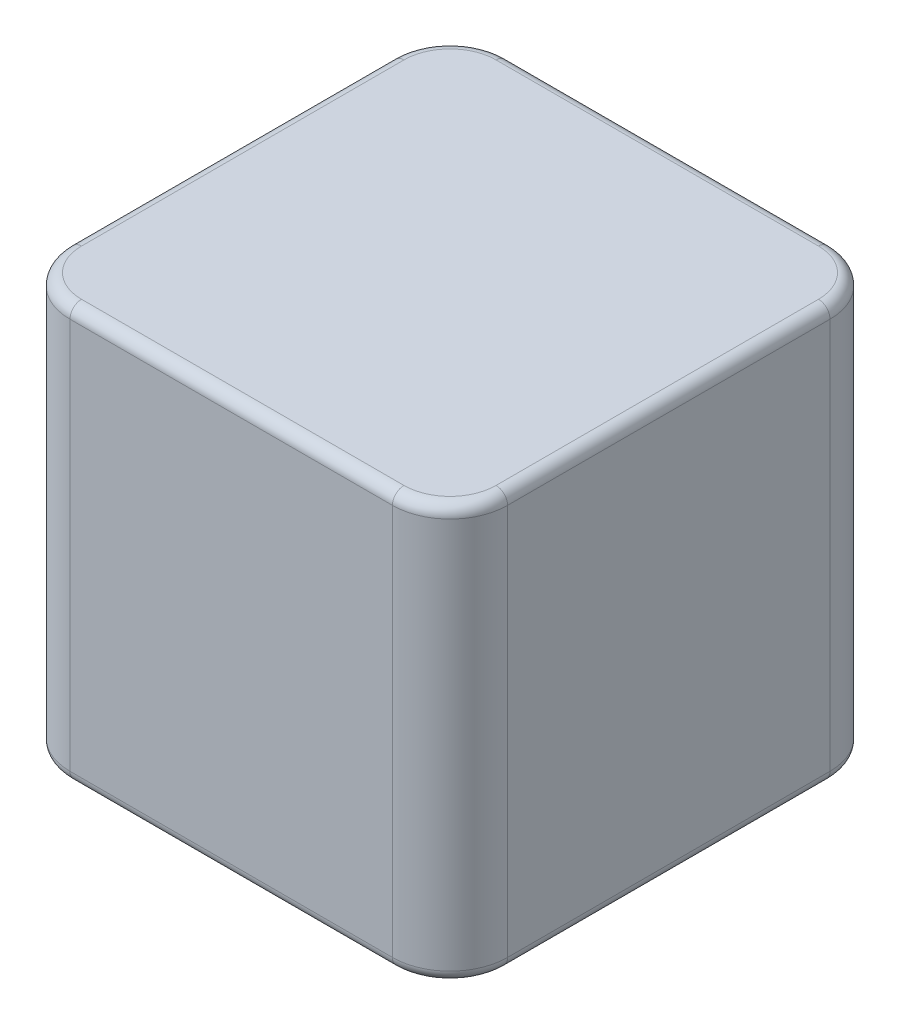
ISO-10303-21;
HEADER;
FILE_DESCRIPTION(('STEP AP214'),'2;1');
FILE_NAME('part.step','',(''),(''),'','','');
FILE_SCHEMA(('AUTOMOTIVE_DESIGN { 1 0 10303 214 1 1 1 1 }'));
ENDSEC;
DATA;
#1=APPLICATION_CONTEXT('core data for automotive mechanical design processes');
#2=APPLICATION_PROTOCOL_DEFINITION('international standard','automotive_design',2000,#1);
#3=PRODUCT_CONTEXT('',#1,'mechanical');
#4=PRODUCT('Part','Part','',(#3));
#5=PRODUCT_RELATED_PRODUCT_CATEGORY('part','',(#4));
#6=PRODUCT_DEFINITION_FORMATION('','',#4);
#7=PRODUCT_DEFINITION_CONTEXT('part definition',#1,'design');
#8=PRODUCT_DEFINITION('design','',#6,#7);
#9=PRODUCT_DEFINITION_SHAPE('','',#8);
#10=(LENGTH_UNIT() NAMED_UNIT(*) SI_UNIT(.MILLI.,.METRE.));
#11=(NAMED_UNIT(*) PLANE_ANGLE_UNIT() SI_UNIT($,.RADIAN.));
#12=(NAMED_UNIT(*) SI_UNIT($,.STERADIAN.) SOLID_ANGLE_UNIT());
#13=UNCERTAINTY_MEASURE_WITH_UNIT(LENGTH_MEASURE(1.E-05),#10,'distance_accuracy_value','');
#14=(GEOMETRIC_REPRESENTATION_CONTEXT(3) GLOBAL_UNCERTAINTY_ASSIGNED_CONTEXT((#13)) GLOBAL_UNIT_ASSIGNED_CONTEXT((#10,
#11,#12)) REPRESENTATION_CONTEXT('',''));
#15=CARTESIAN_POINT('',(0.,0.,0.));
#16=DIRECTION('',(0.,0.,1.));
#17=DIRECTION('',(1.,0.,0.));
#18=AXIS2_PLACEMENT_3D('',#15,#16,#17);
#19=CARTESIAN_POINT('',(19.,36.,19.));
#20=DIRECTION('',(-1.,0.,0.));
#21=DIRECTION('',(0.,0.,1.));
#22=AXIS2_PLACEMENT_3D('',#19,#20,#21);
#23=PLANE('',#22);
#24=DIRECTION('',(0.,-1.,0.));
#25=VECTOR('',#24,1.);
#26=CARTESIAN_POINT('',(19.,36.,14.));
#27=LINE('',#26,#25);
#28=CARTESIAN_POINT('',(19.,35.,14.));
#29=VERTEX_POINT('',#28);
#30=CARTESIAN_POINT('',(19.,1.,14.));
#31=VERTEX_POINT('',#30);
#32=EDGE_CURVE('E295',#29,#31,#27,.T.);
#33=ORIENTED_EDGE('',*,*,#32,.T.);
#34=DIRECTION('',(0.,0.,-1.));
#35=VECTOR('',#34,1.);
#36=CARTESIAN_POINT('',(19.,1.,-14.));
#37=LINE('',#36,#35);
#38=CARTESIAN_POINT('',(19.,1.,-14.));
#39=VERTEX_POINT('',#38);
#40=EDGE_CURVE('E214',#31,#39,#37,.T.);
#41=ORIENTED_EDGE('',*,*,#40,.T.);
#42=DIRECTION('',(0.,-1.,0.));
#43=VECTOR('',#42,1.);
#44=CARTESIAN_POINT('',(19.,36.,-14.));
#45=LINE('',#44,#43);
#46=CARTESIAN_POINT('',(19.,35.,-14.));
#47=VERTEX_POINT('',#46);
#48=EDGE_CURVE('E286',#39,#47,#45,.F.);
#49=ORIENTED_EDGE('',*,*,#48,.T.);
#50=DIRECTION('',(0.,0.,-1.));
#51=VECTOR('',#50,1.);
#52=CARTESIAN_POINT('',(19.,35.,19.));
#53=LINE('',#52,#51);
#54=EDGE_CURVE('E212',#47,#29,#53,.F.);
#55=ORIENTED_EDGE('',*,*,#54,.T.);
#56=EDGE_LOOP('',(#33,#41,#49,#55));
#57=FACE_BOUND('',#56,.T.);
#58=ADVANCED_FACE('F32',(#57),#23,.F.);
#59=CARTESIAN_POINT('',(-19.,36.,-19.));
#60=DIRECTION('',(0.,0.,1.));
#61=DIRECTION('',(1.,0.,0.));
#62=AXIS2_PLACEMENT_3D('',#59,#60,#61);
#63=PLANE('',#62);
#64=DIRECTION('',(0.,-1.,0.));
#65=VECTOR('',#64,1.);
#66=CARTESIAN_POINT('',(14.,36.,-19.));
#67=LINE('',#66,#65);
#68=CARTESIAN_POINT('',(14.,35.,-19.));
#69=VERTEX_POINT('',#68);
#70=CARTESIAN_POINT('',(14.,1.,-19.));
#71=VERTEX_POINT('',#70);
#72=EDGE_CURVE('E289',#69,#71,#67,.T.);
#73=ORIENTED_EDGE('',*,*,#72,.T.);
#74=DIRECTION('',(-1.,0.,0.));
#75=VECTOR('',#74,1.);
#76=CARTESIAN_POINT('',(-14.,1.,-19.));
#77=LINE('',#76,#75);
#78=CARTESIAN_POINT('',(-14.,1.,-19.));
#79=VERTEX_POINT('',#78);
#80=EDGE_CURVE('E206',#71,#79,#77,.T.);
#81=ORIENTED_EDGE('',*,*,#80,.T.);
#82=DIRECTION('',(0.,-1.,0.));
#83=VECTOR('',#82,1.);
#84=CARTESIAN_POINT('',(-14.,36.,-19.));
#85=LINE('',#84,#83);
#86=CARTESIAN_POINT('',(-14.,35.,-19.));
#87=VERTEX_POINT('',#86);
#88=EDGE_CURVE('E597',#79,#87,#85,.F.);
#89=ORIENTED_EDGE('',*,*,#88,.T.);
#90=DIRECTION('',(-1.,0.,0.));
#91=VECTOR('',#90,1.);
#92=CARTESIAN_POINT('',(-19.,35.,-19.));
#93=LINE('',#92,#91);
#94=EDGE_CURVE('E204',#87,#69,#93,.F.);
#95=ORIENTED_EDGE('',*,*,#94,.T.);
#96=EDGE_LOOP('',(#73,#81,#89,#95));
#97=FACE_BOUND('',#96,.T.);
#98=ADVANCED_FACE('F348',(#97),#63,.F.);
#99=CARTESIAN_POINT('',(-19.,36.,19.));
#100=DIRECTION('',(1.,0.,0.));
#101=DIRECTION('',(0.,0.,-1.));
#102=AXIS2_PLACEMENT_3D('',#99,#100,#101);
#103=PLANE('',#102);
#104=DIRECTION('',(0.,-1.,0.));
#105=VECTOR('',#104,1.);
#106=CARTESIAN_POINT('',(-19.,36.,-14.));
#107=LINE('',#106,#105);
#108=CARTESIAN_POINT('',(-19.,35.,-14.));
#109=VERTEX_POINT('',#108);
#110=CARTESIAN_POINT('',(-19.,1.,-14.));
#111=VERTEX_POINT('',#110);
#112=EDGE_CURVE('E172',#109,#111,#107,.T.);
#113=ORIENTED_EDGE('',*,*,#112,.T.);
#114=DIRECTION('',(0.,0.,1.));
#115=VECTOR('',#114,1.);
#116=CARTESIAN_POINT('',(-19.,1.,14.));
#117=LINE('',#116,#115);
#118=CARTESIAN_POINT('',(-19.,1.,14.));
#119=VERTEX_POINT('',#118);
#120=EDGE_CURVE('E198',#111,#119,#117,.T.);
#121=ORIENTED_EDGE('',*,*,#120,.T.);
#122=DIRECTION('',(0.,-1.,0.));
#123=VECTOR('',#122,1.);
#124=CARTESIAN_POINT('',(-19.,36.,14.));
#125=LINE('',#124,#123);
#126=CARTESIAN_POINT('',(-19.,35.,14.));
#127=VERTEX_POINT('',#126);
#128=EDGE_CURVE('E175',#119,#127,#125,.F.);
#129=ORIENTED_EDGE('',*,*,#128,.T.);
#130=DIRECTION('',(0.,0.,1.));
#131=VECTOR('',#130,1.);
#132=CARTESIAN_POINT('',(-19.,35.,19.));
#133=LINE('',#132,#131);
#134=EDGE_CURVE('E196',#127,#109,#133,.F.);
#135=ORIENTED_EDGE('',*,*,#134,.T.);
#136=EDGE_LOOP('',(#113,#121,#129,#135));
#137=FACE_BOUND('',#136,.T.);
#138=ADVANCED_FACE('F307',(#137),#103,.F.);
#139=CARTESIAN_POINT('',(-19.,36.,19.));
#140=DIRECTION('',(0.,0.,-1.));
#141=DIRECTION('',(-1.,0.,0.));
#142=AXIS2_PLACEMENT_3D('',#139,#140,#141);
#143=PLANE('',#142);
#144=DIRECTION('',(0.,-1.,0.));
#145=VECTOR('',#144,1.);
#146=CARTESIAN_POINT('',(-14.,36.,19.));
#147=LINE('',#146,#145);
#148=CARTESIAN_POINT('',(-14.,35.,19.));
#149=VERTEX_POINT('',#148);
#150=CARTESIAN_POINT('',(-14.,1.,19.));
#151=VERTEX_POINT('',#150);
#152=EDGE_CURVE('E294',#149,#151,#147,.T.);
#153=ORIENTED_EDGE('',*,*,#152,.T.);
#154=DIRECTION('',(1.,0.,0.));
#155=VECTOR('',#154,1.);
#156=CARTESIAN_POINT('',(14.,1.,19.));
#157=LINE('',#156,#155);
#158=CARTESIAN_POINT('',(14.,1.,19.));
#159=VERTEX_POINT('',#158);
#160=EDGE_CURVE('E11',#151,#159,#157,.T.);
#161=ORIENTED_EDGE('',*,*,#160,.T.);
#162=DIRECTION('',(0.,-1.,0.));
#163=VECTOR('',#162,1.);
#164=CARTESIAN_POINT('',(14.,36.,19.));
#165=LINE('',#164,#163);
#166=CARTESIAN_POINT('',(14.,35.,19.));
#167=VERTEX_POINT('',#166);
#168=EDGE_CURVE('E298',#159,#167,#165,.F.);
#169=ORIENTED_EDGE('',*,*,#168,.T.);
#170=DIRECTION('',(1.,0.,0.));
#171=VECTOR('',#170,1.);
#172=CARTESIAN_POINT('',(-19.,35.,19.));
#173=LINE('',#172,#171);
#174=EDGE_CURVE('E41',#167,#149,#173,.F.);
#175=ORIENTED_EDGE('',*,*,#174,.T.);
#176=EDGE_LOOP('',(#153,#161,#169,#175));
#177=FACE_BOUND('',#176,.T.);
#178=ADVANCED_FACE('F548',(#177),#143,.F.);
#179=CARTESIAN_POINT('',(0.,36.,0.));
#180=DIRECTION('',(0.,-1.,0.));
#181=DIRECTION('',(0.,0.,-1.));
#182=AXIS2_PLACEMENT_3D('',#179,#180,#181);
#183=PLANE('',#182);
#184=DIRECTION('',(0.,0.,1.));
#185=VECTOR('',#184,1.);
#186=CARTESIAN_POINT('',(-18.,36.,0.));
#187=LINE('',#186,#185);
#188=CARTESIAN_POINT('',(-18.,36.,-14.));
#189=VERTEX_POINT('',#188);
#190=CARTESIAN_POINT('',(-18.,36.,14.));
#191=VERTEX_POINT('',#190);
#192=EDGE_CURVE('E49',#189,#191,#187,.T.);
#193=ORIENTED_EDGE('',*,*,#192,.T.);
#194=CARTESIAN_POINT('',(-14.,36.,14.));
#195=DIRECTION('',(0.,-1.,0.));
#196=DIRECTION('',(0.,0.,-1.));
#197=AXIS2_PLACEMENT_3D('',#194,#195,#196);
#198=CIRCLE('',#197,4.);
#199=CARTESIAN_POINT('',(-14.,36.,18.));
#200=VERTEX_POINT('',#199);
#201=EDGE_CURVE('E231',#191,#200,#198,.F.);
#202=ORIENTED_EDGE('',*,*,#201,.T.);
#203=DIRECTION('',(1.,0.,0.));
#204=VECTOR('',#203,1.);
#205=CARTESIAN_POINT('',(0.,36.,18.));
#206=LINE('',#205,#204);
#207=CARTESIAN_POINT('',(14.,36.,18.));
#208=VERTEX_POINT('',#207);
#209=EDGE_CURVE('E219',#200,#208,#206,.T.);
#210=ORIENTED_EDGE('',*,*,#209,.T.);
#211=CARTESIAN_POINT('',(14.,36.,14.));
#212=DIRECTION('',(0.,-1.,0.));
#213=DIRECTION('',(0.,0.,-1.));
#214=AXIS2_PLACEMENT_3D('',#211,#212,#213);
#215=CIRCLE('',#214,4.);
#216=CARTESIAN_POINT('',(18.,36.,14.));
#217=VERTEX_POINT('',#216);
#218=EDGE_CURVE('E221',#208,#217,#215,.F.);
#219=ORIENTED_EDGE('',*,*,#218,.T.);
#220=DIRECTION('',(0.,0.,-1.));
#221=VECTOR('',#220,1.);
#222=CARTESIAN_POINT('',(18.,36.,0.));
#223=LINE('',#222,#221);
#224=CARTESIAN_POINT('',(18.,36.,-14.));
#225=VERTEX_POINT('',#224);
#226=EDGE_CURVE('E223',#217,#225,#223,.T.);
#227=ORIENTED_EDGE('',*,*,#226,.T.);
#228=CARTESIAN_POINT('',(14.,36.,-14.));
#229=DIRECTION('',(0.,-1.,0.));
#230=DIRECTION('',(0.,0.,-1.));
#231=AXIS2_PLACEMENT_3D('',#228,#229,#230);
#232=CIRCLE('',#231,4.);
#233=CARTESIAN_POINT('',(14.,36.,-18.));
#234=VERTEX_POINT('',#233);
#235=EDGE_CURVE('E225',#225,#234,#232,.F.);
#236=ORIENTED_EDGE('',*,*,#235,.T.);
#237=DIRECTION('',(-1.,0.,0.));
#238=VECTOR('',#237,1.);
#239=CARTESIAN_POINT('',(0.,36.,-18.));
#240=LINE('',#239,#238);
#241=CARTESIAN_POINT('',(-14.,36.,-18.));
#242=VERTEX_POINT('',#241);
#243=EDGE_CURVE('E227',#234,#242,#240,.T.);
#244=ORIENTED_EDGE('',*,*,#243,.T.);
#245=CARTESIAN_POINT('',(-14.,36.,-14.));
#246=DIRECTION('',(0.,-1.,0.));
#247=DIRECTION('',(0.,0.,-1.));
#248=AXIS2_PLACEMENT_3D('',#245,#246,#247);
#249=CIRCLE('',#248,4.);
#250=EDGE_CURVE('E54',#242,#189,#249,.F.);
#251=ORIENTED_EDGE('',*,*,#250,.T.);
#252=EDGE_LOOP('',(#193,#202,#210,#219,#227,#236,#244,#251));
#253=FACE_BOUND('',#252,.T.);
#254=ADVANCED_FACE('F540',(#253),#183,.F.);
#255=CARTESIAN_POINT('',(0.,0.,0.));
#256=DIRECTION('',(0.,-1.,0.));
#257=DIRECTION('',(0.,0.,-1.));
#258=AXIS2_PLACEMENT_3D('',#255,#256,#257);
#259=PLANE('',#258);
#260=DIRECTION('',(1.,0.,0.));
#261=VECTOR('',#260,1.);
#262=CARTESIAN_POINT('',(-14.,0.,18.));
#263=LINE('',#262,#261);
#264=CARTESIAN_POINT('',(14.,0.,18.));
#265=VERTEX_POINT('',#264);
#266=CARTESIAN_POINT('',(-14.,0.,18.));
#267=VERTEX_POINT('',#266);
#268=EDGE_CURVE('E151',#265,#267,#263,.F.);
#269=ORIENTED_EDGE('',*,*,#268,.T.);
#270=CARTESIAN_POINT('',(-14.,0.,14.));
#271=DIRECTION('',(0.,-1.,0.));
#272=DIRECTION('',(0.,0.,-1.));
#273=AXIS2_PLACEMENT_3D('',#270,#271,#272);
#274=CIRCLE('',#273,4.);
#275=CARTESIAN_POINT('',(-18.,0.,14.));
#276=VERTEX_POINT('',#275);
#277=EDGE_CURVE('E188',#267,#276,#274,.T.);
#278=ORIENTED_EDGE('',*,*,#277,.T.);
#279=DIRECTION('',(0.,0.,1.));
#280=VECTOR('',#279,1.);
#281=CARTESIAN_POINT('',(-18.,0.,-14.));
#282=LINE('',#281,#280);
#283=CARTESIAN_POINT('',(-18.,0.,-14.));
#284=VERTEX_POINT('',#283);
#285=EDGE_CURVE('E186',#276,#284,#282,.F.);
#286=ORIENTED_EDGE('',*,*,#285,.T.);
#287=CARTESIAN_POINT('',(-14.,0.,-14.));
#288=DIRECTION('',(0.,-1.,0.));
#289=DIRECTION('',(0.,0.,-1.));
#290=AXIS2_PLACEMENT_3D('',#287,#288,#289);
#291=CIRCLE('',#290,4.);
#292=CARTESIAN_POINT('',(-14.,0.,-18.));
#293=VERTEX_POINT('',#292);
#294=EDGE_CURVE('E184',#284,#293,#291,.T.);
#295=ORIENTED_EDGE('',*,*,#294,.T.);
#296=DIRECTION('',(-1.,0.,0.));
#297=VECTOR('',#296,1.);
#298=CARTESIAN_POINT('',(14.,0.,-18.));
#299=LINE('',#298,#297);
#300=CARTESIAN_POINT('',(14.,0.,-18.));
#301=VERTEX_POINT('',#300);
#302=EDGE_CURVE('E182',#293,#301,#299,.F.);
#303=ORIENTED_EDGE('',*,*,#302,.T.);
#304=CARTESIAN_POINT('',(14.,0.,-14.));
#305=DIRECTION('',(0.,-1.,0.));
#306=DIRECTION('',(0.,0.,-1.));
#307=AXIS2_PLACEMENT_3D('',#304,#305,#306);
#308=CIRCLE('',#307,4.);
#309=CARTESIAN_POINT('',(18.,0.,-14.));
#310=VERTEX_POINT('',#309);
#311=EDGE_CURVE('E180',#301,#310,#308,.T.);
#312=ORIENTED_EDGE('',*,*,#311,.T.);
#313=DIRECTION('',(0.,0.,-1.));
#314=VECTOR('',#313,1.);
#315=CARTESIAN_POINT('',(18.,0.,14.));
#316=LINE('',#315,#314);
#317=CARTESIAN_POINT('',(18.,0.,14.));
#318=VERTEX_POINT('',#317);
#319=EDGE_CURVE('E154',#310,#318,#316,.F.);
#320=ORIENTED_EDGE('',*,*,#319,.T.);
#321=CARTESIAN_POINT('',(14.,0.,14.));
#322=DIRECTION('',(0.,-1.,0.));
#323=DIRECTION('',(0.,0.,-1.));
#324=AXIS2_PLACEMENT_3D('',#321,#322,#323);
#325=CIRCLE('',#324,4.);
#326=EDGE_CURVE('E145',#318,#265,#325,.T.);
#327=ORIENTED_EDGE('',*,*,#326,.T.);
#328=EDGE_LOOP('',(#269,#278,#286,#295,#303,#312,#320,#327));
#329=FACE_BOUND('',#328,.T.);
#330=CARTESIAN_POINT('',(0.,0.,0.));
#331=DIRECTION('',(0.,-1.,0.));
#332=DIRECTION('',(0.,0.,-1.));
#333=AXIS2_PLACEMENT_3D('',#330,#331,#332);
#334=CIRCLE('',#333,7.);
#335=CARTESIAN_POINT('',(0.,0.,-7.));
#336=VERTEX_POINT('',#335);
#337=EDGE_CURVE('E249',#336,#336,#334,.T.);
#338=ORIENTED_EDGE('',*,*,#337,.F.);
#339=EDGE_LOOP('',(#338));
#340=FACE_BOUND('',#339,.T.);
#341=ADVANCED_FACE('F147',(#329,#340),#259,.T.);
#342=CARTESIAN_POINT('',(0.,2.,0.));
#343=DIRECTION('',(0.,-1.,0.));
#344=DIRECTION('',(0.,0.,-1.));
#345=AXIS2_PLACEMENT_3D('',#342,#343,#344);
#346=CYLINDRICAL_SURFACE('',#345,7.);
#347=CARTESIAN_POINT('',(0.,2.,0.));
#348=DIRECTION('',(0.,-1.,0.));
#349=DIRECTION('',(0.,0.,-1.));
#350=AXIS2_PLACEMENT_3D('',#347,#348,#349);
#351=CIRCLE('',#350,7.);
#352=CARTESIAN_POINT('',(0.,2.,-7.));
#353=VERTEX_POINT('',#352);
#354=EDGE_CURVE('E598',#353,#353,#351,.T.);
#355=ORIENTED_EDGE('',*,*,#354,.F.);
#356=EDGE_LOOP('',(#355));
#357=FACE_BOUND('',#356,.T.);
#358=ORIENTED_EDGE('',*,*,#337,.T.);
#359=EDGE_LOOP('',(#358));
#360=FACE_BOUND('',#359,.T.);
#361=ADVANCED_FACE('F524',(#357,#360),#346,.F.);
#362=CARTESIAN_POINT('',(0.,2.,0.));
#363=DIRECTION('',(0.,-1.,0.));
#364=DIRECTION('',(0.,0.,-1.));
#365=AXIS2_PLACEMENT_3D('',#362,#363,#364);
#366=PLANE('',#365);
#367=ORIENTED_EDGE('',*,*,#354,.T.);
#368=EDGE_LOOP('',(#367));
#369=FACE_BOUND('',#368,.T.);
#370=ADVANCED_FACE('F360',(#369),#366,.T.);
#371=CARTESIAN_POINT('',(14.,36.,-14.));
#372=DIRECTION('',(0.,-1.,0.));
#373=DIRECTION('',(0.,0.,-1.));
#374=AXIS2_PLACEMENT_3D('',#371,#372,#373);
#375=CYLINDRICAL_SURFACE('',#374,5.);
#376=ORIENTED_EDGE('',*,*,#48,.F.);
#377=CARTESIAN_POINT('',(14.,1.,-14.));
#378=DIRECTION('',(0.,-1.,0.));
#379=DIRECTION('',(0.,0.,-1.));
#380=AXIS2_PLACEMENT_3D('',#377,#378,#379);
#381=CIRCLE('',#380,5.);
#382=EDGE_CURVE('E210',#39,#71,#381,.F.);
#383=ORIENTED_EDGE('',*,*,#382,.T.);
#384=ORIENTED_EDGE('',*,*,#72,.F.);
#385=CARTESIAN_POINT('',(14.,35.,-14.));
#386=DIRECTION('',(0.,-1.,0.));
#387=DIRECTION('',(0.,0.,-1.));
#388=AXIS2_PLACEMENT_3D('',#385,#386,#387);
#389=CIRCLE('',#388,5.);
#390=EDGE_CURVE('E208',#69,#47,#389,.T.);
#391=ORIENTED_EDGE('',*,*,#390,.T.);
#392=EDGE_LOOP('',(#376,#383,#384,#391));
#393=FACE_BOUND('',#392,.T.);
#394=ADVANCED_FACE('F285',(#393),#375,.T.);
#395=CARTESIAN_POINT('',(14.,36.,14.));
#396=DIRECTION('',(0.,-1.,0.));
#397=DIRECTION('',(0.,0.,-1.));
#398=AXIS2_PLACEMENT_3D('',#395,#396,#397);
#399=CYLINDRICAL_SURFACE('',#398,5.);
#400=ORIENTED_EDGE('',*,*,#168,.F.);
#401=CARTESIAN_POINT('',(14.,1.,14.));
#402=DIRECTION('',(0.,-1.,0.));
#403=DIRECTION('',(0.,0.,-1.));
#404=AXIS2_PLACEMENT_3D('',#401,#402,#403);
#405=CIRCLE('',#404,5.);
#406=EDGE_CURVE('E163',#159,#31,#405,.F.);
#407=ORIENTED_EDGE('',*,*,#406,.T.);
#408=ORIENTED_EDGE('',*,*,#32,.F.);
#409=CARTESIAN_POINT('',(14.,35.,14.));
#410=DIRECTION('',(0.,-1.,0.));
#411=DIRECTION('',(0.,0.,-1.));
#412=AXIS2_PLACEMENT_3D('',#409,#410,#411);
#413=CIRCLE('',#412,5.);
#414=EDGE_CURVE('E216',#29,#167,#413,.T.);
#415=ORIENTED_EDGE('',*,*,#414,.T.);
#416=EDGE_LOOP('',(#400,#407,#408,#415));
#417=FACE_BOUND('',#416,.T.);
#418=ADVANCED_FACE('F359',(#417),#399,.T.);
#419=CARTESIAN_POINT('',(-14.,36.,-14.));
#420=DIRECTION('',(0.,-1.,0.));
#421=DIRECTION('',(0.,0.,-1.));
#422=AXIS2_PLACEMENT_3D('',#419,#420,#421);
#423=CYLINDRICAL_SURFACE('',#422,5.);
#424=ORIENTED_EDGE('',*,*,#88,.F.);
#425=CARTESIAN_POINT('',(-14.,1.,-14.));
#426=DIRECTION('',(0.,-1.,0.));
#427=DIRECTION('',(0.,0.,-1.));
#428=AXIS2_PLACEMENT_3D('',#425,#426,#427);
#429=CIRCLE('',#428,5.);
#430=EDGE_CURVE('E202',#79,#111,#429,.F.);
#431=ORIENTED_EDGE('',*,*,#430,.T.);
#432=ORIENTED_EDGE('',*,*,#112,.F.);
#433=CARTESIAN_POINT('',(-14.,35.,-14.));
#434=DIRECTION('',(0.,-1.,0.));
#435=DIRECTION('',(0.,0.,-1.));
#436=AXIS2_PLACEMENT_3D('',#433,#434,#435);
#437=CIRCLE('',#436,5.);
#438=EDGE_CURVE('E200',#109,#87,#437,.T.);
#439=ORIENTED_EDGE('',*,*,#438,.T.);
#440=EDGE_LOOP('',(#424,#431,#432,#439));
#441=FACE_BOUND('',#440,.T.);
#442=ADVANCED_FACE('F363',(#441),#423,.T.);
#443=CARTESIAN_POINT('',(-14.,36.,14.));
#444=DIRECTION('',(0.,-1.,0.));
#445=DIRECTION('',(0.,0.,-1.));
#446=AXIS2_PLACEMENT_3D('',#443,#444,#445);
#447=CYLINDRICAL_SURFACE('',#446,5.);
#448=ORIENTED_EDGE('',*,*,#128,.F.);
#449=CARTESIAN_POINT('',(-14.,1.,14.));
#450=DIRECTION('',(0.,-1.,0.));
#451=DIRECTION('',(0.,0.,-1.));
#452=AXIS2_PLACEMENT_3D('',#449,#450,#451);
#453=CIRCLE('',#452,5.);
#454=EDGE_CURVE('E193',#119,#151,#453,.F.);
#455=ORIENTED_EDGE('',*,*,#454,.T.);
#456=ORIENTED_EDGE('',*,*,#152,.F.);
#457=CARTESIAN_POINT('',(-14.,35.,14.));
#458=DIRECTION('',(0.,-1.,0.));
#459=DIRECTION('',(0.,0.,-1.));
#460=AXIS2_PLACEMENT_3D('',#457,#458,#459);
#461=CIRCLE('',#460,5.);
#462=EDGE_CURVE('E190',#149,#127,#461,.T.);
#463=ORIENTED_EDGE('',*,*,#462,.T.);
#464=EDGE_LOOP('',(#448,#455,#456,#463));
#465=FACE_BOUND('',#464,.T.);
#466=ADVANCED_FACE('F313',(#465),#447,.T.);
#467=CARTESIAN_POINT('',(14.,1.,-14.));
#468=DIRECTION('',(0.,-1.,0.));
#469=DIRECTION('',(0.,0.,-1.));
#470=AXIS2_PLACEMENT_3D('',#467,#468,#469);
#471=TOROIDAL_SURFACE('',#470,4.,1.);
#472=CARTESIAN_POINT('',(14.,1.,-18.));
#473=DIRECTION('',(-1.,0.,0.));
#474=DIRECTION('',(0.,0.,1.));
#475=AXIS2_PLACEMENT_3D('',#472,#473,#474);
#476=CIRCLE('',#475,1.);
#477=EDGE_CURVE('E243',#71,#301,#476,.T.);
#478=ORIENTED_EDGE('',*,*,#477,.F.);
#479=ORIENTED_EDGE('',*,*,#382,.F.);
#480=CARTESIAN_POINT('',(18.,1.,-14.));
#481=DIRECTION('',(0.,0.,1.));
#482=DIRECTION('',(1.,0.,0.));
#483=AXIS2_PLACEMENT_3D('',#480,#481,#482);
#484=CIRCLE('',#483,1.);
#485=EDGE_CURVE('E246',#310,#39,#484,.T.);
#486=ORIENTED_EDGE('',*,*,#485,.F.);
#487=ORIENTED_EDGE('',*,*,#311,.F.);
#488=EDGE_LOOP('',(#478,#479,#486,#487));
#489=FACE_BOUND('',#488,.T.);
#490=ADVANCED_FACE('F336',(#489),#471,.T.);
#491=CARTESIAN_POINT('',(18.,1.,19.));
#492=DIRECTION('',(0.,0.,1.));
#493=DIRECTION('',(1.,0.,0.));
#494=AXIS2_PLACEMENT_3D('',#491,#492,#493);
#495=CYLINDRICAL_SURFACE('',#494,1.);
#496=ORIENTED_EDGE('',*,*,#485,.T.);
#497=ORIENTED_EDGE('',*,*,#40,.F.);
#498=CARTESIAN_POINT('',(18.,1.,14.));
#499=DIRECTION('',(0.,0.,1.));
#500=DIRECTION('',(1.,0.,0.));
#501=AXIS2_PLACEMENT_3D('',#498,#499,#500);
#502=CIRCLE('',#501,1.);
#503=EDGE_CURVE('E241',#318,#31,#502,.T.);
#504=ORIENTED_EDGE('',*,*,#503,.F.);
#505=ORIENTED_EDGE('',*,*,#319,.F.);
#506=EDGE_LOOP('',(#496,#497,#504,#505));
#507=FACE_BOUND('',#506,.T.);
#508=ADVANCED_FACE('F338',(#507),#495,.T.);
#509=CARTESIAN_POINT('',(-19.,1.,-18.));
#510=DIRECTION('',(1.,0.,0.));
#511=DIRECTION('',(0.,0.,-1.));
#512=AXIS2_PLACEMENT_3D('',#509,#510,#511);
#513=CYLINDRICAL_SURFACE('',#512,1.);
#514=ORIENTED_EDGE('',*,*,#477,.T.);
#515=ORIENTED_EDGE('',*,*,#302,.F.);
#516=CARTESIAN_POINT('',(-14.,1.,-18.));
#517=DIRECTION('',(-1.,0.,0.));
#518=DIRECTION('',(0.,0.,1.));
#519=AXIS2_PLACEMENT_3D('',#516,#517,#518);
#520=CIRCLE('',#519,1.);
#521=EDGE_CURVE('E166',#79,#293,#520,.T.);
#522=ORIENTED_EDGE('',*,*,#521,.F.);
#523=ORIENTED_EDGE('',*,*,#80,.F.);
#524=EDGE_LOOP('',(#514,#515,#522,#523));
#525=FACE_BOUND('',#524,.T.);
#526=ADVANCED_FACE('F331',(#525),#513,.T.);
#527=CARTESIAN_POINT('',(14.,1.,14.));
#528=DIRECTION('',(0.,-1.,0.));
#529=DIRECTION('',(0.,0.,-1.));
#530=AXIS2_PLACEMENT_3D('',#527,#528,#529);
#531=TOROIDAL_SURFACE('',#530,4.,1.);
#532=ORIENTED_EDGE('',*,*,#503,.T.);
#533=ORIENTED_EDGE('',*,*,#406,.F.);
#534=CARTESIAN_POINT('',(14.,1.,18.));
#535=DIRECTION('',(-1.,0.,0.));
#536=DIRECTION('',(0.,0.,1.));
#537=AXIS2_PLACEMENT_3D('',#534,#535,#536);
#538=CIRCLE('',#537,1.);
#539=EDGE_CURVE('E161',#265,#159,#538,.T.);
#540=ORIENTED_EDGE('',*,*,#539,.F.);
#541=ORIENTED_EDGE('',*,*,#326,.F.);
#542=EDGE_LOOP('',(#532,#533,#540,#541));
#543=FACE_BOUND('',#542,.T.);
#544=ADVANCED_FACE('F162',(#543),#531,.T.);
#545=CARTESIAN_POINT('',(-14.,1.,-14.));
#546=DIRECTION('',(0.,-1.,0.));
#547=DIRECTION('',(0.,0.,-1.));
#548=AXIS2_PLACEMENT_3D('',#545,#546,#547);
#549=TOROIDAL_SURFACE('',#548,4.,1.);
#550=ORIENTED_EDGE('',*,*,#521,.T.);
#551=ORIENTED_EDGE('',*,*,#294,.F.);
#552=CARTESIAN_POINT('',(-18.,1.,-14.));
#553=DIRECTION('',(0.,0.,1.));
#554=DIRECTION('',(1.,0.,0.));
#555=AXIS2_PLACEMENT_3D('',#552,#553,#554);
#556=CIRCLE('',#555,1.);
#557=EDGE_CURVE('E167',#111,#284,#556,.T.);
#558=ORIENTED_EDGE('',*,*,#557,.F.);
#559=ORIENTED_EDGE('',*,*,#430,.F.);
#560=EDGE_LOOP('',(#550,#551,#558,#559));
#561=FACE_BOUND('',#560,.T.);
#562=ADVANCED_FACE('F326',(#561),#549,.T.);
#563=CARTESIAN_POINT('',(-19.,1.,18.));
#564=DIRECTION('',(-1.,0.,0.));
#565=DIRECTION('',(0.,0.,1.));
#566=AXIS2_PLACEMENT_3D('',#563,#564,#565);
#567=CYLINDRICAL_SURFACE('',#566,1.);
#568=ORIENTED_EDGE('',*,*,#539,.T.);
#569=ORIENTED_EDGE('',*,*,#160,.F.);
#570=CARTESIAN_POINT('',(-14.,1.,18.));
#571=DIRECTION('',(-1.,0.,0.));
#572=DIRECTION('',(0.,0.,1.));
#573=AXIS2_PLACEMENT_3D('',#570,#571,#572);
#574=CIRCLE('',#573,1.);
#575=EDGE_CURVE('E170',#267,#151,#574,.T.);
#576=ORIENTED_EDGE('',*,*,#575,.F.);
#577=ORIENTED_EDGE('',*,*,#268,.F.);
#578=EDGE_LOOP('',(#568,#569,#576,#577));
#579=FACE_BOUND('',#578,.T.);
#580=ADVANCED_FACE('F169',(#579),#567,.T.);
#581=CARTESIAN_POINT('',(-18.,1.,19.));
#582=DIRECTION('',(0.,0.,-1.));
#583=DIRECTION('',(-1.,0.,0.));
#584=AXIS2_PLACEMENT_3D('',#581,#582,#583);
#585=CYLINDRICAL_SURFACE('',#584,1.);
#586=ORIENTED_EDGE('',*,*,#557,.T.);
#587=ORIENTED_EDGE('',*,*,#285,.F.);
#588=CARTESIAN_POINT('',(-18.,1.,14.));
#589=DIRECTION('',(0.,0.,1.));
#590=DIRECTION('',(1.,0.,0.));
#591=AXIS2_PLACEMENT_3D('',#588,#589,#590);
#592=CIRCLE('',#591,1.);
#593=EDGE_CURVE('E234',#119,#276,#592,.T.);
#594=ORIENTED_EDGE('',*,*,#593,.F.);
#595=ORIENTED_EDGE('',*,*,#120,.F.);
#596=EDGE_LOOP('',(#586,#587,#594,#595));
#597=FACE_BOUND('',#596,.T.);
#598=ADVANCED_FACE('F321',(#597),#585,.T.);
#599=CARTESIAN_POINT('',(-14.,1.,14.));
#600=DIRECTION('',(0.,-1.,0.));
#601=DIRECTION('',(0.,0.,-1.));
#602=AXIS2_PLACEMENT_3D('',#599,#600,#601);
#603=TOROIDAL_SURFACE('',#602,4.,1.);
#604=ORIENTED_EDGE('',*,*,#575,.T.);
#605=ORIENTED_EDGE('',*,*,#454,.F.);
#606=ORIENTED_EDGE('',*,*,#593,.T.);
#607=ORIENTED_EDGE('',*,*,#277,.F.);
#608=EDGE_LOOP('',(#604,#605,#606,#607));
#609=FACE_BOUND('',#608,.T.);
#610=ADVANCED_FACE('F318',(#609),#603,.T.);
#611=CARTESIAN_POINT('',(14.,35.,-14.));
#612=DIRECTION('',(0.,-1.,0.));
#613=DIRECTION('',(0.,0.,-1.));
#614=AXIS2_PLACEMENT_3D('',#611,#612,#613);
#615=TOROIDAL_SURFACE('',#614,4.,1.);
#616=CARTESIAN_POINT('',(18.,35.,-14.));
#617=DIRECTION('',(0.,0.,1.));
#618=DIRECTION('',(1.,0.,0.));
#619=AXIS2_PLACEMENT_3D('',#616,#617,#618);
#620=CIRCLE('',#619,1.);
#621=EDGE_CURVE('E265',#47,#225,#620,.T.);
#622=ORIENTED_EDGE('',*,*,#621,.F.);
#623=ORIENTED_EDGE('',*,*,#390,.F.);
#624=CARTESIAN_POINT('',(14.,35.,-18.));
#625=DIRECTION('',(-1.,0.,0.));
#626=DIRECTION('',(0.,0.,1.));
#627=AXIS2_PLACEMENT_3D('',#624,#625,#626);
#628=CIRCLE('',#627,1.);
#629=EDGE_CURVE('E36',#234,#69,#628,.T.);
#630=ORIENTED_EDGE('',*,*,#629,.F.);
#631=ORIENTED_EDGE('',*,*,#235,.F.);
#632=EDGE_LOOP('',(#622,#623,#630,#631));
#633=FACE_BOUND('',#632,.T.);
#634=ADVANCED_FACE('F34',(#633),#615,.T.);
#635=CARTESIAN_POINT('',(0.,35.,-18.));
#636=DIRECTION('',(-1.,0.,0.));
#637=DIRECTION('',(0.,0.,1.));
#638=AXIS2_PLACEMENT_3D('',#635,#636,#637);
#639=CYLINDRICAL_SURFACE('',#638,1.);
#640=ORIENTED_EDGE('',*,*,#629,.T.);
#641=ORIENTED_EDGE('',*,*,#94,.F.);
#642=CARTESIAN_POINT('',(-14.,35.,-18.));
#643=DIRECTION('',(-1.,0.,0.));
#644=DIRECTION('',(0.,0.,1.));
#645=AXIS2_PLACEMENT_3D('',#642,#643,#644);
#646=CIRCLE('',#645,1.);
#647=EDGE_CURVE('E263',#242,#87,#646,.T.);
#648=ORIENTED_EDGE('',*,*,#647,.F.);
#649=ORIENTED_EDGE('',*,*,#243,.F.);
#650=EDGE_LOOP('',(#640,#641,#648,#649));
#651=FACE_BOUND('',#650,.T.);
#652=ADVANCED_FACE('F276',(#651),#639,.T.);
#653=CARTESIAN_POINT('',(18.,35.,0.));
#654=DIRECTION('',(0.,0.,-1.));
#655=DIRECTION('',(-1.,0.,0.));
#656=AXIS2_PLACEMENT_3D('',#653,#654,#655);
#657=CYLINDRICAL_SURFACE('',#656,1.);
#658=ORIENTED_EDGE('',*,*,#621,.T.);
#659=ORIENTED_EDGE('',*,*,#226,.F.);
#660=CARTESIAN_POINT('',(18.,35.,14.));
#661=DIRECTION('',(0.,0.,1.));
#662=DIRECTION('',(1.,0.,0.));
#663=AXIS2_PLACEMENT_3D('',#660,#661,#662);
#664=CIRCLE('',#663,1.);
#665=EDGE_CURVE('E260',#29,#217,#664,.T.);
#666=ORIENTED_EDGE('',*,*,#665,.F.);
#667=ORIENTED_EDGE('',*,*,#54,.F.);
#668=EDGE_LOOP('',(#658,#659,#666,#667));
#669=FACE_BOUND('',#668,.T.);
#670=ADVANCED_FACE('F410',(#669),#657,.T.);
#671=CARTESIAN_POINT('',(-14.,35.,-14.));
#672=DIRECTION('',(0.,-1.,0.));
#673=DIRECTION('',(0.,0.,-1.));
#674=AXIS2_PLACEMENT_3D('',#671,#672,#673);
#675=TOROIDAL_SURFACE('',#674,4.,1.);
#676=ORIENTED_EDGE('',*,*,#647,.T.);
#677=ORIENTED_EDGE('',*,*,#438,.F.);
#678=CARTESIAN_POINT('',(-18.,35.,-14.));
#679=DIRECTION('',(0.,0.,1.));
#680=DIRECTION('',(1.,0.,0.));
#681=AXIS2_PLACEMENT_3D('',#678,#679,#680);
#682=CIRCLE('',#681,1.);
#683=EDGE_CURVE('E257',#189,#109,#682,.T.);
#684=ORIENTED_EDGE('',*,*,#683,.F.);
#685=ORIENTED_EDGE('',*,*,#250,.F.);
#686=EDGE_LOOP('',(#676,#677,#684,#685));
#687=FACE_BOUND('',#686,.T.);
#688=ADVANCED_FACE('F416',(#687),#675,.T.);
#689=CARTESIAN_POINT('',(14.,35.,14.));
#690=DIRECTION('',(0.,-1.,0.));
#691=DIRECTION('',(0.,0.,-1.));
#692=AXIS2_PLACEMENT_3D('',#689,#690,#691);
#693=TOROIDAL_SURFACE('',#692,4.,1.);
#694=ORIENTED_EDGE('',*,*,#665,.T.);
#695=ORIENTED_EDGE('',*,*,#218,.F.);
#696=CARTESIAN_POINT('',(14.,35.,18.));
#697=DIRECTION('',(-1.,0.,0.));
#698=DIRECTION('',(0.,0.,1.));
#699=AXIS2_PLACEMENT_3D('',#696,#697,#698);
#700=CIRCLE('',#699,1.);
#701=EDGE_CURVE('E254',#167,#208,#700,.T.);
#702=ORIENTED_EDGE('',*,*,#701,.F.);
#703=ORIENTED_EDGE('',*,*,#414,.F.);
#704=EDGE_LOOP('',(#694,#695,#702,#703));
#705=FACE_BOUND('',#704,.T.);
#706=ADVANCED_FACE('F423',(#705),#693,.T.);
#707=CARTESIAN_POINT('',(-18.,35.,0.));
#708=DIRECTION('',(0.,0.,1.));
#709=DIRECTION('',(1.,0.,0.));
#710=AXIS2_PLACEMENT_3D('',#707,#708,#709);
#711=CYLINDRICAL_SURFACE('',#710,1.);
#712=ORIENTED_EDGE('',*,*,#683,.T.);
#713=ORIENTED_EDGE('',*,*,#134,.F.);
#714=CARTESIAN_POINT('',(-18.,35.,14.));
#715=DIRECTION('',(0.,0.,1.));
#716=DIRECTION('',(1.,0.,0.));
#717=AXIS2_PLACEMENT_3D('',#714,#715,#716);
#718=CIRCLE('',#717,1.);
#719=EDGE_CURVE('E252',#191,#127,#718,.T.);
#720=ORIENTED_EDGE('',*,*,#719,.F.);
#721=ORIENTED_EDGE('',*,*,#192,.F.);
#722=EDGE_LOOP('',(#712,#713,#720,#721));
#723=FACE_BOUND('',#722,.T.);
#724=ADVANCED_FACE('F431',(#723),#711,.T.);
#725=CARTESIAN_POINT('',(0.,35.,18.));
#726=DIRECTION('',(1.,0.,0.));
#727=DIRECTION('',(0.,0.,-1.));
#728=AXIS2_PLACEMENT_3D('',#725,#726,#727);
#729=CYLINDRICAL_SURFACE('',#728,1.);
#730=ORIENTED_EDGE('',*,*,#701,.T.);
#731=ORIENTED_EDGE('',*,*,#209,.F.);
#732=CARTESIAN_POINT('',(-14.,35.,18.));
#733=DIRECTION('',(-1.,0.,0.));
#734=DIRECTION('',(0.,0.,1.));
#735=AXIS2_PLACEMENT_3D('',#732,#733,#734);
#736=CIRCLE('',#735,1.);
#737=EDGE_CURVE('E250',#149,#200,#736,.T.);
#738=ORIENTED_EDGE('',*,*,#737,.F.);
#739=ORIENTED_EDGE('',*,*,#174,.F.);
#740=EDGE_LOOP('',(#730,#731,#738,#739));
#741=FACE_BOUND('',#740,.T.);
#742=ADVANCED_FACE('F439',(#741),#729,.T.);
#743=CARTESIAN_POINT('',(-14.,35.,14.));
#744=DIRECTION('',(0.,-1.,0.));
#745=DIRECTION('',(0.,0.,-1.));
#746=AXIS2_PLACEMENT_3D('',#743,#744,#745);
#747=TOROIDAL_SURFACE('',#746,4.,1.);
#748=ORIENTED_EDGE('',*,*,#719,.T.);
#749=ORIENTED_EDGE('',*,*,#462,.F.);
#750=ORIENTED_EDGE('',*,*,#737,.T.);
#751=ORIENTED_EDGE('',*,*,#201,.F.);
#752=EDGE_LOOP('',(#748,#749,#750,#751));
#753=FACE_BOUND('',#752,.T.);
#754=ADVANCED_FACE('F447',(#753),#747,.T.);
#755=CLOSED_SHELL('',(#58,#98,#138,#178,#254,#341,#361,#370,#394,#418,#442,#466,#490,#508,#526,
#544,#562,#580,#598,#610,#634,#652,#670,#688,#706,#724,#742,#754));
#756=MANIFOLD_SOLID_BREP('B2',#755);
#757=ADVANCED_BREP_SHAPE_REPRESENTATION('',(#18,#756),#14);
#758=SHAPE_DEFINITION_REPRESENTATION(#9,#757);
ENDSEC;
END-ISO-10303-21;
